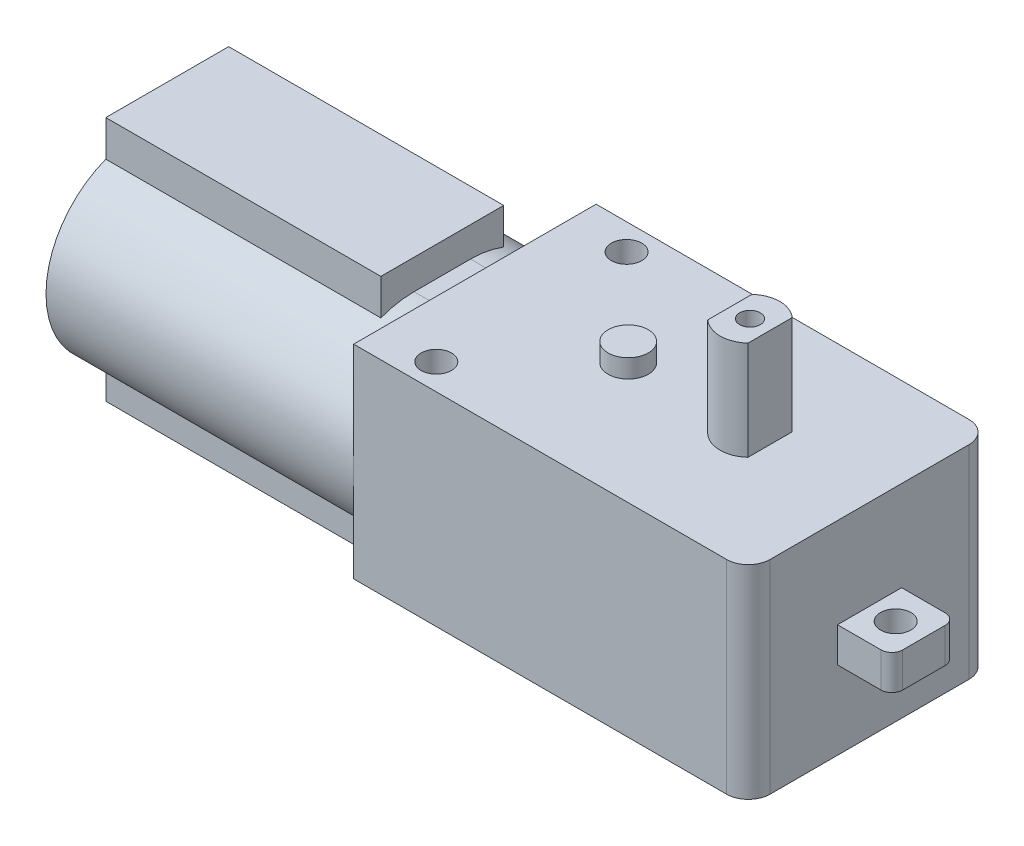
ISO-10303-21;
HEADER;
FILE_DESCRIPTION(('STEP AP214'),'2;1');
FILE_NAME('part.step','',(''),(''),'','','');
FILE_SCHEMA(('AUTOMOTIVE_DESIGN { 1 0 10303 214 1 1 1 1 }'));
ENDSEC;
DATA;
#1=APPLICATION_CONTEXT('core data for automotive mechanical design processes');
#2=APPLICATION_PROTOCOL_DEFINITION('international standard','automotive_design',2000,#1);
#3=PRODUCT_CONTEXT('',#1,'mechanical');
#4=PRODUCT('Part','Part','',(#3));
#5=PRODUCT_RELATED_PRODUCT_CATEGORY('part','',(#4));
#6=PRODUCT_DEFINITION_FORMATION('','',#4);
#7=PRODUCT_DEFINITION_CONTEXT('part definition',#1,'design');
#8=PRODUCT_DEFINITION('design','',#6,#7);
#9=PRODUCT_DEFINITION_SHAPE('','',#8);
#10=(LENGTH_UNIT() NAMED_UNIT(*) SI_UNIT(.MILLI.,.METRE.));
#11=(NAMED_UNIT(*) PLANE_ANGLE_UNIT() SI_UNIT($,.RADIAN.));
#12=(NAMED_UNIT(*) SI_UNIT($,.STERADIAN.) SOLID_ANGLE_UNIT());
#13=UNCERTAINTY_MEASURE_WITH_UNIT(LENGTH_MEASURE(1.E-05),#10,'distance_accuracy_value','');
#14=(GEOMETRIC_REPRESENTATION_CONTEXT(3) GLOBAL_UNCERTAINTY_ASSIGNED_CONTEXT((#13)) GLOBAL_UNIT_ASSIGNED_CONTEXT((#10,
#11,#12)) REPRESENTATION_CONTEXT('',''));
#15=CARTESIAN_POINT('',(0.,0.,0.));
#16=DIRECTION('',(0.,0.,1.));
#17=DIRECTION('',(1.,0.,0.));
#18=AXIS2_PLACEMENT_3D('',#15,#16,#17);
#19=CARTESIAN_POINT('',(-25.3,18.7,-11.15));
#20=DIRECTION('',(1.,0.,0.));
#21=DIRECTION('',(0.,0.,-1.));
#22=AXIS2_PLACEMENT_3D('',#19,#20,#21);
#23=PLANE('',#22);
#24=CARTESIAN_POINT('',(-25.3,8.55,-2.59999999999999));
#25=DIRECTION('',(-1.,0.,0.));
#26=DIRECTION('',(0.,0.,1.));
#27=AXIS2_PLACEMENT_3D('',#24,#25,#26);
#28=CIRCLE('',#27,8.55);
#29=CARTESIAN_POINT('',(-25.3,8.55,-11.15));
#30=VERTEX_POINT('',#29);
#31=CARTESIAN_POINT('',(-25.3,0.,-2.59999999999999));
#32=VERTEX_POINT('',#31);
#33=EDGE_CURVE('E44',#30,#32,#28,.T.);
#34=ORIENTED_EDGE('',*,*,#33,.F.);
#35=DIRECTION('',(0.,-1.,0.));
#36=VECTOR('',#35,1.);
#37=CARTESIAN_POINT('',(-25.3,18.7,-11.15));
#38=LINE('',#37,#36);
#39=CARTESIAN_POINT('',(-25.3,0.,-11.15));
#40=VERTEX_POINT('',#39);
#41=EDGE_CURVE('E448',#30,#40,#38,.T.);
#42=ORIENTED_EDGE('',*,*,#41,.T.);
#43=DIRECTION('',(0.,0.,1.));
#44=VECTOR('',#43,1.);
#45=CARTESIAN_POINT('',(-25.3,0.,-11.15));
#46=LINE('',#45,#44);
#47=EDGE_CURVE('E454',#40,#32,#46,.T.);
#48=ORIENTED_EDGE('',*,*,#47,.T.);
#49=EDGE_LOOP('',(#34,#42,#48));
#50=FACE_BOUND('',#49,.T.);
#51=ADVANCED_FACE('F35',(#50),#23,.F.);
#52=CARTESIAN_POINT('',(-25.3,17.1,-2.59999999999999));
#53=VERTEX_POINT('',#52);
#54=EDGE_CURVE('E300',#53,#30,#28,.T.);
#55=ORIENTED_EDGE('',*,*,#54,.F.);
#56=DIRECTION('',(0.,0.,-1.));
#57=VECTOR('',#56,1.);
#58=CARTESIAN_POINT('',(-25.3,17.1,-2.59999999999999));
#59=LINE('',#58,#57);
#60=CARTESIAN_POINT('',(-25.3,17.1,2.6));
#61=VERTEX_POINT('',#60);
#62=EDGE_CURVE('E297',#61,#53,#59,.T.);
#63=ORIENTED_EDGE('',*,*,#62,.F.);
#64=CARTESIAN_POINT('',(-25.3,8.55,2.6));
#65=DIRECTION('',(-1.,0.,0.));
#66=DIRECTION('',(0.,0.,1.));
#67=AXIS2_PLACEMENT_3D('',#64,#65,#66);
#68=CIRCLE('',#67,8.55);
#69=CARTESIAN_POINT('',(-25.3,8.55,11.15));
#70=VERTEX_POINT('',#69);
#71=EDGE_CURVE('E304',#70,#61,#68,.T.);
#72=ORIENTED_EDGE('',*,*,#71,.F.);
#73=DIRECTION('',(0.,-1.,0.));
#74=VECTOR('',#73,1.);
#75=CARTESIAN_POINT('',(-25.3,18.7,11.15));
#76=LINE('',#75,#74);
#77=CARTESIAN_POINT('',(-25.3,18.7,11.15));
#78=VERTEX_POINT('',#77);
#79=EDGE_CURVE('E460',#78,#70,#76,.T.);
#80=ORIENTED_EDGE('',*,*,#79,.F.);
#81=DIRECTION('',(0.,0.,1.));
#82=VECTOR('',#81,1.);
#83=CARTESIAN_POINT('',(-25.3,18.7,-11.15));
#84=LINE('',#83,#82);
#85=CARTESIAN_POINT('',(-25.3,18.7,-11.15));
#86=VERTEX_POINT('',#85);
#87=EDGE_CURVE('E435',#86,#78,#84,.T.);
#88=ORIENTED_EDGE('',*,*,#87,.F.);
#89=EDGE_CURVE('E476',#86,#30,#38,.T.);
#90=ORIENTED_EDGE('',*,*,#89,.T.);
#91=EDGE_LOOP('',(#55,#63,#72,#80,#88,#90));
#92=FACE_BOUND('',#91,.T.);
#93=ADVANCED_FACE('F533',(#92),#23,.F.);
#94=CARTESIAN_POINT('',(-25.3,0.,2.6));
#95=VERTEX_POINT('',#94);
#96=EDGE_CURVE('E303',#95,#70,#68,.T.);
#97=ORIENTED_EDGE('',*,*,#96,.F.);
#98=CARTESIAN_POINT('',(-25.3,0.,11.15));
#99=VERTEX_POINT('',#98);
#100=EDGE_CURVE('E311',#95,#99,#46,.T.);
#101=ORIENTED_EDGE('',*,*,#100,.T.);
#102=EDGE_CURVE('E463',#70,#99,#76,.T.);
#103=ORIENTED_EDGE('',*,*,#102,.F.);
#104=EDGE_LOOP('',(#97,#101,#103));
#105=FACE_BOUND('',#104,.T.);
#106=ADVANCED_FACE('F523',(#105),#23,.F.);
#107=CARTESIAN_POINT('',(11.,18.7,-9.14999999999999));
#108=DIRECTION('',(-1.,0.,0.));
#109=DIRECTION('',(0.,0.,1.));
#110=AXIS2_PLACEMENT_3D('',#107,#108,#109);
#111=PLANE('',#110);
#112=DIRECTION('',(0.,0.,-1.));
#113=VECTOR('',#112,1.);
#114=CARTESIAN_POINT('',(11.,0.,-9.14999999999999));
#115=LINE('',#114,#113);
#116=CARTESIAN_POINT('',(11.,0.,9.14999999999999));
#117=VERTEX_POINT('',#116);
#118=CARTESIAN_POINT('',(11.,0.,-9.14999999999999));
#119=VERTEX_POINT('',#118);
#120=EDGE_CURVE('E483',#117,#119,#115,.T.);
#121=ORIENTED_EDGE('',*,*,#120,.T.);
#122=DIRECTION('',(0.,-1.,0.));
#123=VECTOR('',#122,1.);
#124=CARTESIAN_POINT('',(11.,18.7,-9.14999999999999));
#125=LINE('',#124,#123);
#126=CARTESIAN_POINT('',(11.,18.7,-9.14999999999999));
#127=VERTEX_POINT('',#126);
#128=EDGE_CURVE('E470',#127,#119,#125,.T.);
#129=ORIENTED_EDGE('',*,*,#128,.F.);
#130=DIRECTION('',(0.,0.,-1.));
#131=VECTOR('',#130,1.);
#132=CARTESIAN_POINT('',(11.,18.7,-9.14999999999999));
#133=LINE('',#132,#131);
#134=CARTESIAN_POINT('',(11.,18.7,9.14999999999999));
#135=VERTEX_POINT('',#134);
#136=EDGE_CURVE('E443',#135,#127,#133,.T.);
#137=ORIENTED_EDGE('',*,*,#136,.F.);
#138=DIRECTION('',(0.,-1.,0.));
#139=VECTOR('',#138,1.);
#140=CARTESIAN_POINT('',(11.,18.7,9.14999999999999));
#141=LINE('',#140,#139);
#142=EDGE_CURVE('E467',#135,#117,#141,.T.);
#143=ORIENTED_EDGE('',*,*,#142,.T.);
#144=EDGE_LOOP('',(#121,#129,#137,#143));
#145=FACE_BOUND('',#144,.T.);
#146=DIRECTION('',(0.,0.,-1.));
#147=VECTOR('',#146,1.);
#148=CARTESIAN_POINT('',(11.,10.4,2.95));
#149=LINE('',#148,#147);
#150=CARTESIAN_POINT('',(11.,10.4,2.95));
#151=VERTEX_POINT('',#150);
#152=CARTESIAN_POINT('',(11.,10.4,-2.95));
#153=VERTEX_POINT('',#152);
#154=EDGE_CURVE('E338',#151,#153,#149,.T.);
#155=ORIENTED_EDGE('',*,*,#154,.T.);
#156=DIRECTION('',(0.,-1.,0.));
#157=VECTOR('',#156,1.);
#158=CARTESIAN_POINT('',(11.,10.4,-2.95));
#159=LINE('',#158,#157);
#160=CARTESIAN_POINT('',(11.,7.2,-2.95));
#161=VERTEX_POINT('',#160);
#162=EDGE_CURVE('E357',#153,#161,#159,.T.);
#163=ORIENTED_EDGE('',*,*,#162,.T.);
#164=DIRECTION('',(0.,0.,-1.));
#165=VECTOR('',#164,1.);
#166=CARTESIAN_POINT('',(11.,7.2,2.95));
#167=LINE('',#166,#165);
#168=CARTESIAN_POINT('',(11.,7.2,2.95));
#169=VERTEX_POINT('',#168);
#170=EDGE_CURVE('E335',#169,#161,#167,.T.);
#171=ORIENTED_EDGE('',*,*,#170,.F.);
#172=DIRECTION('',(0.,-1.,0.));
#173=VECTOR('',#172,1.);
#174=CARTESIAN_POINT('',(11.,10.4,2.95));
#175=LINE('',#174,#173);
#176=EDGE_CURVE('E373',#151,#169,#175,.T.);
#177=ORIENTED_EDGE('',*,*,#176,.F.);
#178=EDGE_LOOP('',(#155,#163,#171,#177));
#179=FACE_BOUND('',#178,.T.);
#180=ADVANCED_FACE('F505',(#145,#179),#111,.F.);
#181=CARTESIAN_POINT('',(9.,18.7,9.15));
#182=DIRECTION('',(0.,1.,0.));
#183=DIRECTION('',(0.,0.,1.));
#184=AXIS2_PLACEMENT_3D('',#181,#182,#183);
#185=PLANE('',#184);
#186=CARTESIAN_POINT('',(-20.1,18.7,8.75));
#187=DIRECTION('',(0.,1.,0.));
#188=DIRECTION('',(0.,0.,1.));
#189=AXIS2_PLACEMENT_3D('',#186,#187,#188);
#190=CIRCLE('',#189,1.4);
#191=CARTESIAN_POINT('',(-20.1,18.7,10.15));
#192=VERTEX_POINT('',#191);
#193=EDGE_CURVE('E424',#192,#192,#190,.T.);
#194=ORIENTED_EDGE('',*,*,#193,.F.);
#195=EDGE_LOOP('',(#194));
#196=FACE_BOUND('',#195,.T.);
#197=ORIENTED_EDGE('',*,*,#87,.T.);
#198=DIRECTION('',(1.,0.,0.));
#199=VECTOR('',#198,1.);
#200=CARTESIAN_POINT('',(-25.3,18.7,11.15));
#201=LINE('',#200,#199);
#202=CARTESIAN_POINT('',(8.99999999999999,18.7,11.15));
#203=VERTEX_POINT('',#202);
#204=EDGE_CURVE('E438',#78,#203,#201,.T.);
#205=ORIENTED_EDGE('',*,*,#204,.T.);
#206=CARTESIAN_POINT('',(9.,18.7,9.15));
#207=DIRECTION('',(0.,1.,0.));
#208=DIRECTION('',(0.,0.,1.));
#209=AXIS2_PLACEMENT_3D('',#206,#207,#208);
#210=CIRCLE('',#209,2.);
#211=EDGE_CURVE('E441',#203,#135,#210,.T.);
#212=ORIENTED_EDGE('',*,*,#211,.T.);
#213=ORIENTED_EDGE('',*,*,#136,.T.);
#214=CARTESIAN_POINT('',(9.,18.7,-9.15));
#215=DIRECTION('',(0.,1.,0.));
#216=DIRECTION('',(0.,0.,-1.));
#217=AXIS2_PLACEMENT_3D('',#214,#215,#216);
#218=CIRCLE('',#217,2.);
#219=CARTESIAN_POINT('',(8.99999999999999,18.7,-11.15));
#220=VERTEX_POINT('',#219);
#221=EDGE_CURVE('E445',#127,#220,#218,.T.);
#222=ORIENTED_EDGE('',*,*,#221,.T.);
#223=DIRECTION('',(-1.,0.,0.));
#224=VECTOR('',#223,1.);
#225=CARTESIAN_POINT('',(-25.3,18.7,-11.15));
#226=LINE('',#225,#224);
#227=EDGE_CURVE('E447',#220,#86,#226,.T.);
#228=ORIENTED_EDGE('',*,*,#227,.T.);
#229=EDGE_LOOP('',(#197,#205,#212,#213,#222,#228));
#230=FACE_BOUND('',#229,.T.);
#231=CARTESIAN_POINT('',(-20.1,18.7,-8.75));
#232=DIRECTION('',(0.,1.,0.));
#233=DIRECTION('',(0.,0.,1.));
#234=AXIS2_PLACEMENT_3D('',#231,#232,#233);
#235=CIRCLE('',#234,1.4);
#236=CARTESIAN_POINT('',(-20.1,18.7,-7.35));
#237=VERTEX_POINT('',#236);
#238=EDGE_CURVE('E430',#237,#237,#235,.T.);
#239=ORIENTED_EDGE('',*,*,#238,.F.);
#240=EDGE_LOOP('',(#239));
#241=FACE_BOUND('',#240,.T.);
#242=DIRECTION('',(0.,0.,1.));
#243=VECTOR('',#242,1.);
#244=CARTESIAN_POINT('',(1.85,18.7,0.));
#245=LINE('',#244,#243);
#246=CARTESIAN_POINT('',(1.85,18.7,-2.03469899493758));
#247=VERTEX_POINT('',#246);
#248=CARTESIAN_POINT('',(1.85,18.7,2.03469899493758));
#249=VERTEX_POINT('',#248);
#250=EDGE_CURVE('E390',#247,#249,#245,.T.);
#251=ORIENTED_EDGE('',*,*,#250,.T.);
#252=CARTESIAN_POINT('',(0.,18.7,0.));
#253=DIRECTION('',(0.,1.,0.));
#254=DIRECTION('',(0.,0.,1.));
#255=AXIS2_PLACEMENT_3D('',#252,#253,#254);
#256=CIRCLE('',#255,2.75);
#257=CARTESIAN_POINT('',(-1.85,18.7,2.03469899493758));
#258=VERTEX_POINT('',#257);
#259=EDGE_CURVE('E397',#258,#249,#256,.T.);
#260=ORIENTED_EDGE('',*,*,#259,.F.);
#261=DIRECTION('',(0.,0.,1.));
#262=VECTOR('',#261,1.);
#263=CARTESIAN_POINT('',(-1.85,18.7,0.));
#264=LINE('',#263,#262);
#265=CARTESIAN_POINT('',(-1.85,18.7,-2.03469899493758));
#266=VERTEX_POINT('',#265);
#267=EDGE_CURVE('E412',#266,#258,#264,.T.);
#268=ORIENTED_EDGE('',*,*,#267,.F.);
#269=EDGE_CURVE('E409',#247,#266,#256,.T.);
#270=ORIENTED_EDGE('',*,*,#269,.F.);
#271=EDGE_LOOP('',(#251,#260,#268,#270));
#272=FACE_BOUND('',#271,.T.);
#273=CARTESIAN_POINT('',(-11.2,18.7,0.));
#274=DIRECTION('',(0.,1.,0.));
#275=DIRECTION('',(0.,0.,1.));
#276=AXIS2_PLACEMENT_3D('',#273,#274,#275);
#277=CIRCLE('',#276,1.85);
#278=CARTESIAN_POINT('',(-11.2,18.7,1.85));
#279=VERTEX_POINT('',#278);
#280=EDGE_CURVE('E376',#279,#279,#277,.T.);
#281=ORIENTED_EDGE('',*,*,#280,.F.);
#282=EDGE_LOOP('',(#281));
#283=FACE_BOUND('',#282,.T.);
#284=ADVANCED_FACE('F514',(#196,#230,#241,#272,#283),#185,.T.);
#285=CARTESIAN_POINT('',(9.,0.,9.15));
#286=DIRECTION('',(0.,1.,0.));
#287=DIRECTION('',(0.,0.,1.));
#288=AXIS2_PLACEMENT_3D('',#285,#286,#287);
#289=PLANE('',#288);
#290=CARTESIAN_POINT('',(-20.1,0.,-8.75));
#291=DIRECTION('',(0.,1.,0.));
#292=DIRECTION('',(0.,0.,1.));
#293=AXIS2_PLACEMENT_3D('',#290,#291,#292);
#294=CIRCLE('',#293,1.4);
#295=CARTESIAN_POINT('',(-20.1,0.,-7.35));
#296=VERTEX_POINT('',#295);
#297=EDGE_CURVE('E427',#296,#296,#294,.T.);
#298=ORIENTED_EDGE('',*,*,#297,.T.);
#299=EDGE_LOOP('',(#298));
#300=FACE_BOUND('',#299,.T.);
#301=DIRECTION('',(1.,0.,0.));
#302=VECTOR('',#301,1.);
#303=CARTESIAN_POINT('',(-53.6,0.,2.6));
#304=LINE('',#303,#302);
#305=CARTESIAN_POINT('',(-28.3,0.,2.6));
#306=VERTEX_POINT('',#305);
#307=EDGE_CURVE('E318',#306,#95,#304,.T.);
#308=ORIENTED_EDGE('',*,*,#307,.F.);
#309=DIRECTION('',(0.,0.,-1.));
#310=VECTOR('',#309,1.);
#311=CARTESIAN_POINT('',(-28.3,0.,9.15000000000001));
#312=LINE('',#311,#310);
#313=CARTESIAN_POINT('',(-28.3,0.,-2.59999999999999));
#314=VERTEX_POINT('',#313);
#315=EDGE_CURVE('E290',#306,#314,#312,.T.);
#316=ORIENTED_EDGE('',*,*,#315,.T.);
#317=DIRECTION('',(1.,0.,0.));
#318=VECTOR('',#317,1.);
#319=CARTESIAN_POINT('',(-53.6,0.,-2.59999999999998));
#320=LINE('',#319,#318);
#321=EDGE_CURVE('E38',#314,#32,#320,.T.);
#322=ORIENTED_EDGE('',*,*,#321,.T.);
#323=ORIENTED_EDGE('',*,*,#47,.F.);
#324=DIRECTION('',(-1.,0.,0.));
#325=VECTOR('',#324,1.);
#326=CARTESIAN_POINT('',(-25.3,0.,-11.15));
#327=LINE('',#326,#325);
#328=CARTESIAN_POINT('',(8.99999999999999,0.,-11.15));
#329=VERTEX_POINT('',#328);
#330=EDGE_CURVE('E439',#329,#40,#327,.T.);
#331=ORIENTED_EDGE('',*,*,#330,.F.);
#332=CARTESIAN_POINT('',(9.,0.,-9.15));
#333=DIRECTION('',(0.,1.,0.));
#334=DIRECTION('',(0.,0.,-1.));
#335=AXIS2_PLACEMENT_3D('',#332,#333,#334);
#336=CIRCLE('',#335,2.);
#337=EDGE_CURVE('E481',#119,#329,#336,.T.);
#338=ORIENTED_EDGE('',*,*,#337,.F.);
#339=ORIENTED_EDGE('',*,*,#120,.F.);
#340=CARTESIAN_POINT('',(9.,0.,9.15));
#341=DIRECTION('',(0.,1.,0.));
#342=DIRECTION('',(0.,0.,1.));
#343=AXIS2_PLACEMENT_3D('',#340,#341,#342);
#344=CIRCLE('',#343,2.);
#345=CARTESIAN_POINT('',(8.99999999999999,0.,11.15));
#346=VERTEX_POINT('',#345);
#347=EDGE_CURVE('E484',#346,#117,#344,.T.);
#348=ORIENTED_EDGE('',*,*,#347,.F.);
#349=DIRECTION('',(1.,0.,0.));
#350=VECTOR('',#349,1.);
#351=CARTESIAN_POINT('',(-25.3,0.,11.15));
#352=LINE('',#351,#350);
#353=EDGE_CURVE('E451',#99,#346,#352,.T.);
#354=ORIENTED_EDGE('',*,*,#353,.F.);
#355=ORIENTED_EDGE('',*,*,#100,.F.);
#356=EDGE_LOOP('',(#308,#316,#322,#323,#331,#338,#339,#348,#354,#355));
#357=FACE_BOUND('',#356,.T.);
#358=CARTESIAN_POINT('',(-20.1,0.,8.75));
#359=DIRECTION('',(0.,1.,0.));
#360=DIRECTION('',(0.,0.,1.));
#361=AXIS2_PLACEMENT_3D('',#358,#359,#360);
#362=CIRCLE('',#361,1.4);
#363=CARTESIAN_POINT('',(-20.1,0.,10.15));
#364=VERTEX_POINT('',#363);
#365=EDGE_CURVE('E423',#364,#364,#362,.T.);
#366=ORIENTED_EDGE('',*,*,#365,.T.);
#367=EDGE_LOOP('',(#366));
#368=FACE_BOUND('',#367,.T.);
#369=ADVANCED_FACE('F499',(#300,#357,#368),#289,.F.);
#370=CARTESIAN_POINT('',(-25.3,18.7,11.15));
#371=DIRECTION('',(0.,0.,-1.));
#372=DIRECTION('',(-1.,0.,0.));
#373=AXIS2_PLACEMENT_3D('',#370,#371,#372);
#374=PLANE('',#373);
#375=ORIENTED_EDGE('',*,*,#353,.T.);
#376=DIRECTION('',(0.,-1.,0.));
#377=VECTOR('',#376,1.);
#378=CARTESIAN_POINT('',(8.99999999999999,18.7,11.15));
#379=LINE('',#378,#377);
#380=EDGE_CURVE('E464',#203,#346,#379,.T.);
#381=ORIENTED_EDGE('',*,*,#380,.F.);
#382=ORIENTED_EDGE('',*,*,#204,.F.);
#383=ORIENTED_EDGE('',*,*,#79,.T.);
#384=ORIENTED_EDGE('',*,*,#102,.T.);
#385=EDGE_LOOP('',(#375,#381,#382,#383,#384));
#386=FACE_BOUND('',#385,.T.);
#387=ADVANCED_FACE('F491',(#386),#374,.F.);
#388=CARTESIAN_POINT('',(9.,18.7,9.15));
#389=DIRECTION('',(0.,-1.,0.));
#390=DIRECTION('',(0.,0.,-1.));
#391=AXIS2_PLACEMENT_3D('',#388,#389,#390);
#392=CYLINDRICAL_SURFACE('',#391,2.);
#393=ORIENTED_EDGE('',*,*,#347,.T.);
#394=ORIENTED_EDGE('',*,*,#142,.F.);
#395=ORIENTED_EDGE('',*,*,#211,.F.);
#396=ORIENTED_EDGE('',*,*,#380,.T.);
#397=EDGE_LOOP('',(#393,#394,#395,#396));
#398=FACE_BOUND('',#397,.T.);
#399=ADVANCED_FACE('F497',(#398),#392,.T.);
#400=CARTESIAN_POINT('',(9.,18.7,-9.15));
#401=DIRECTION('',(0.,-1.,0.));
#402=DIRECTION('',(0.,0.,-1.));
#403=AXIS2_PLACEMENT_3D('',#400,#401,#402);
#404=CYLINDRICAL_SURFACE('',#403,2.);
#405=ORIENTED_EDGE('',*,*,#337,.T.);
#406=DIRECTION('',(0.,-1.,0.));
#407=VECTOR('',#406,1.);
#408=CARTESIAN_POINT('',(8.99999999999999,18.7,-11.15));
#409=LINE('',#408,#407);
#410=EDGE_CURVE('E473',#220,#329,#409,.T.);
#411=ORIENTED_EDGE('',*,*,#410,.F.);
#412=ORIENTED_EDGE('',*,*,#221,.F.);
#413=ORIENTED_EDGE('',*,*,#128,.T.);
#414=EDGE_LOOP('',(#405,#411,#412,#413));
#415=FACE_BOUND('',#414,.T.);
#416=ADVANCED_FACE('F510',(#415),#404,.T.);
#417=CARTESIAN_POINT('',(-25.3,18.7,-11.15));
#418=DIRECTION('',(0.,0.,1.));
#419=DIRECTION('',(1.,0.,0.));
#420=AXIS2_PLACEMENT_3D('',#417,#418,#419);
#421=PLANE('',#420);
#422=ORIENTED_EDGE('',*,*,#330,.T.);
#423=ORIENTED_EDGE('',*,*,#41,.F.);
#424=ORIENTED_EDGE('',*,*,#89,.F.);
#425=ORIENTED_EDGE('',*,*,#227,.F.);
#426=ORIENTED_EDGE('',*,*,#410,.T.);
#427=EDGE_LOOP('',(#422,#423,#424,#425,#426));
#428=FACE_BOUND('',#427,.T.);
#429=ADVANCED_FACE('F532',(#428),#421,.F.);
#430=CARTESIAN_POINT('',(-20.1,18.7,-8.75));
#431=DIRECTION('',(0.,-1.,0.));
#432=DIRECTION('',(0.,0.,-1.));
#433=AXIS2_PLACEMENT_3D('',#430,#431,#432);
#434=CYLINDRICAL_SURFACE('',#433,1.4);
#435=ORIENTED_EDGE('',*,*,#238,.T.);
#436=EDGE_LOOP('',(#435));
#437=FACE_BOUND('',#436,.T.);
#438=ORIENTED_EDGE('',*,*,#297,.F.);
#439=EDGE_LOOP('',(#438));
#440=FACE_BOUND('',#439,.T.);
#441=ADVANCED_FACE('F595',(#437,#440),#434,.F.);
#442=CARTESIAN_POINT('',(-20.1,18.7,8.75));
#443=DIRECTION('',(0.,-1.,0.));
#444=DIRECTION('',(0.,0.,-1.));
#445=AXIS2_PLACEMENT_3D('',#442,#443,#444);
#446=CYLINDRICAL_SURFACE('',#445,1.4);
#447=ORIENTED_EDGE('',*,*,#193,.T.);
#448=EDGE_LOOP('',(#447));
#449=FACE_BOUND('',#448,.T.);
#450=ORIENTED_EDGE('',*,*,#365,.F.);
#451=EDGE_LOOP('',(#450));
#452=FACE_BOUND('',#451,.T.);
#453=ADVANCED_FACE('F600',(#449,#452),#446,.F.);
#454=CARTESIAN_POINT('',(1.85,27.8,0.));
#455=DIRECTION('',(1.,0.,0.));
#456=DIRECTION('',(0.,0.,-1.));
#457=AXIS2_PLACEMENT_3D('',#454,#455,#456);
#458=PLANE('',#457);
#459=ORIENTED_EDGE('',*,*,#250,.F.);
#460=DIRECTION('',(0.,-1.,0.));
#461=VECTOR('',#460,1.);
#462=CARTESIAN_POINT('',(1.85,27.8,-2.03469899493758));
#463=LINE('',#462,#461);
#464=CARTESIAN_POINT('',(1.85,27.8,-2.03469899493758));
#465=VERTEX_POINT('',#464);
#466=EDGE_CURVE('E421',#465,#247,#463,.T.);
#467=ORIENTED_EDGE('',*,*,#466,.F.);
#468=DIRECTION('',(0.,0.,1.));
#469=VECTOR('',#468,1.);
#470=CARTESIAN_POINT('',(1.85,27.8,0.));
#471=LINE('',#470,#469);
#472=CARTESIAN_POINT('',(1.85,27.8,2.03469899493758));
#473=VERTEX_POINT('',#472);
#474=EDGE_CURVE('E396',#465,#473,#471,.T.);
#475=ORIENTED_EDGE('',*,*,#474,.T.);
#476=DIRECTION('',(0.,-1.,0.));
#477=VECTOR('',#476,1.);
#478=CARTESIAN_POINT('',(1.85,27.8,2.03469899493758));
#479=LINE('',#478,#477);
#480=EDGE_CURVE('E414',#473,#249,#479,.T.);
#481=ORIENTED_EDGE('',*,*,#480,.T.);
#482=EDGE_LOOP('',(#459,#467,#475,#481));
#483=FACE_BOUND('',#482,.T.);
#484=ADVANCED_FACE('F633',(#483),#458,.T.);
#485=CARTESIAN_POINT('',(0.,27.8,0.));
#486=DIRECTION('',(0.,-1.,0.));
#487=DIRECTION('',(0.,0.,-1.));
#488=AXIS2_PLACEMENT_3D('',#485,#486,#487);
#489=CYLINDRICAL_SURFACE('',#488,2.75);
#490=ORIENTED_EDGE('',*,*,#269,.T.);
#491=DIRECTION('',(0.,-1.,0.));
#492=VECTOR('',#491,1.);
#493=CARTESIAN_POINT('',(-1.85,27.8,-2.03469899493758));
#494=LINE('',#493,#492);
#495=CARTESIAN_POINT('',(-1.85,27.8,-2.03469899493758));
#496=VERTEX_POINT('',#495);
#497=EDGE_CURVE('E419',#496,#266,#494,.T.);
#498=ORIENTED_EDGE('',*,*,#497,.F.);
#499=CARTESIAN_POINT('',(0.,27.8,0.));
#500=DIRECTION('',(0.,1.,0.));
#501=DIRECTION('',(0.,0.,1.));
#502=AXIS2_PLACEMENT_3D('',#499,#500,#501);
#503=CIRCLE('',#502,2.75);
#504=EDGE_CURVE('E400',#465,#496,#503,.T.);
#505=ORIENTED_EDGE('',*,*,#504,.F.);
#506=ORIENTED_EDGE('',*,*,#466,.T.);
#507=EDGE_LOOP('',(#490,#498,#505,#506));
#508=FACE_BOUND('',#507,.T.);
#509=ADVANCED_FACE('F653',(#508),#489,.T.);
#510=CARTESIAN_POINT('',(-1.85,27.8,0.));
#511=DIRECTION('',(1.,0.,0.));
#512=DIRECTION('',(0.,0.,-1.));
#513=AXIS2_PLACEMENT_3D('',#510,#511,#512);
#514=PLANE('',#513);
#515=ORIENTED_EDGE('',*,*,#267,.T.);
#516=DIRECTION('',(0.,-1.,0.));
#517=VECTOR('',#516,1.);
#518=CARTESIAN_POINT('',(-1.85,27.8,2.03469899493758));
#519=LINE('',#518,#517);
#520=CARTESIAN_POINT('',(-1.85,27.8,2.03469899493758));
#521=VERTEX_POINT('',#520);
#522=EDGE_CURVE('E416',#521,#258,#519,.T.);
#523=ORIENTED_EDGE('',*,*,#522,.F.);
#524=DIRECTION('',(0.,0.,1.));
#525=VECTOR('',#524,1.);
#526=CARTESIAN_POINT('',(-1.85,27.8,0.));
#527=LINE('',#526,#525);
#528=EDGE_CURVE('E403',#496,#521,#527,.T.);
#529=ORIENTED_EDGE('',*,*,#528,.F.);
#530=ORIENTED_EDGE('',*,*,#497,.T.);
#531=EDGE_LOOP('',(#515,#523,#529,#530));
#532=FACE_BOUND('',#531,.T.);
#533=ADVANCED_FACE('F662',(#532),#514,.F.);
#534=CARTESIAN_POINT('',(0.,27.8,0.));
#535=DIRECTION('',(0.,-1.,0.));
#536=DIRECTION('',(0.,0.,-1.));
#537=AXIS2_PLACEMENT_3D('',#534,#535,#536);
#538=CYLINDRICAL_SURFACE('',#537,0.95);
#539=CARTESIAN_POINT('',(0.,27.8,0.));
#540=DIRECTION('',(0.,1.,0.));
#541=DIRECTION('',(0.,0.,1.));
#542=AXIS2_PLACEMENT_3D('',#539,#540,#541);
#543=CIRCLE('',#542,0.95);
#544=CARTESIAN_POINT('',(0.,27.8,0.95));
#545=VERTEX_POINT('',#544);
#546=EDGE_CURVE('E393',#545,#545,#543,.T.);
#547=ORIENTED_EDGE('',*,*,#546,.T.);
#548=EDGE_LOOP('',(#547));
#549=FACE_BOUND('',#548,.T.);
#550=CARTESIAN_POINT('',(0.,18.7,0.));
#551=DIRECTION('',(0.,1.,0.));
#552=DIRECTION('',(0.,0.,1.));
#553=AXIS2_PLACEMENT_3D('',#550,#551,#552);
#554=CIRCLE('',#553,0.95);
#555=CARTESIAN_POINT('',(0.,18.7,0.95));
#556=VERTEX_POINT('',#555);
#557=EDGE_CURVE('E457',#556,#556,#554,.F.);
#558=ORIENTED_EDGE('',*,*,#557,.T.);
#559=EDGE_LOOP('',(#558));
#560=FACE_BOUND('',#559,.T.);
#561=ADVANCED_FACE('F672',(#549,#560),#538,.F.);
#562=ORIENTED_EDGE('',*,*,#259,.T.);
#563=ORIENTED_EDGE('',*,*,#480,.F.);
#564=EDGE_CURVE('E404',#521,#473,#503,.T.);
#565=ORIENTED_EDGE('',*,*,#564,.F.);
#566=ORIENTED_EDGE('',*,*,#522,.T.);
#567=EDGE_LOOP('',(#562,#563,#565,#566));
#568=FACE_BOUND('',#567,.T.);
#569=ADVANCED_FACE('F665',(#568),#489,.T.);
#570=CARTESIAN_POINT('',(0.,27.8,0.));
#571=DIRECTION('',(0.,1.,0.));
#572=DIRECTION('',(0.,0.,1.));
#573=AXIS2_PLACEMENT_3D('',#570,#571,#572);
#574=PLANE('',#573);
#575=ORIENTED_EDGE('',*,*,#546,.F.);
#576=EDGE_LOOP('',(#575));
#577=FACE_BOUND('',#576,.T.);
#578=ORIENTED_EDGE('',*,*,#474,.F.);
#579=ORIENTED_EDGE('',*,*,#504,.T.);
#580=ORIENTED_EDGE('',*,*,#528,.T.);
#581=ORIENTED_EDGE('',*,*,#564,.T.);
#582=EDGE_LOOP('',(#578,#579,#580,#581));
#583=FACE_BOUND('',#582,.T.);
#584=ADVANCED_FACE('F644',(#577,#583),#574,.T.);
#585=ORIENTED_EDGE('',*,*,#557,.F.);
#586=EDGE_LOOP('',(#585));
#587=FACE_BOUND('',#586,.T.);
#588=ADVANCED_FACE('F580',(#587),#185,.T.);
#589=CARTESIAN_POINT('',(-11.2,20.4,0.));
#590=DIRECTION('',(0.,-1.,0.));
#591=DIRECTION('',(0.,0.,-1.));
#592=AXIS2_PLACEMENT_3D('',#589,#590,#591);
#593=CYLINDRICAL_SURFACE('',#592,1.85);
#594=CARTESIAN_POINT('',(-11.2,20.4,0.));
#595=DIRECTION('',(0.,1.,0.));
#596=DIRECTION('',(0.,0.,1.));
#597=AXIS2_PLACEMENT_3D('',#594,#595,#596);
#598=CIRCLE('',#597,1.85);
#599=CARTESIAN_POINT('',(-11.2,20.4,1.85));
#600=VERTEX_POINT('',#599);
#601=EDGE_CURVE('E387',#600,#600,#598,.T.);
#602=ORIENTED_EDGE('',*,*,#601,.F.);
#603=EDGE_LOOP('',(#602));
#604=FACE_BOUND('',#603,.T.);
#605=ORIENTED_EDGE('',*,*,#280,.T.);
#606=EDGE_LOOP('',(#605));
#607=FACE_BOUND('',#606,.T.);
#608=ADVANCED_FACE('F643',(#604,#607),#593,.T.);
#609=CARTESIAN_POINT('',(-11.2,20.4,0.));
#610=DIRECTION('',(0.,1.,0.));
#611=DIRECTION('',(0.,0.,1.));
#612=AXIS2_PLACEMENT_3D('',#609,#610,#611);
#613=PLANE('',#612);
#614=ORIENTED_EDGE('',*,*,#601,.T.);
#615=EDGE_LOOP('',(#614));
#616=FACE_BOUND('',#615,.T.);
#617=ADVANCED_FACE('F707',(#616),#613,.T.);
#618=CARTESIAN_POINT('',(11.,10.4,2.95));
#619=DIRECTION('',(0.,0.,1.));
#620=DIRECTION('',(1.,0.,0.));
#621=AXIS2_PLACEMENT_3D('',#618,#619,#620);
#622=PLANE('',#621);
#623=DIRECTION('',(-1.,0.,0.));
#624=VECTOR('',#623,1.);
#625=CARTESIAN_POINT('',(11.,7.2,2.95));
#626=LINE('',#625,#624);
#627=CARTESIAN_POINT('',(15.,7.2,2.95));
#628=VERTEX_POINT('',#627);
#629=EDGE_CURVE('E342',#628,#169,#626,.T.);
#630=ORIENTED_EDGE('',*,*,#629,.F.);
#631=DIRECTION('',(0.,-1.,0.));
#632=VECTOR('',#631,1.);
#633=CARTESIAN_POINT('',(15.,10.4,2.95));
#634=LINE('',#633,#632);
#635=CARTESIAN_POINT('',(15.,10.4,2.95));
#636=VERTEX_POINT('',#635);
#637=EDGE_CURVE('E377',#636,#628,#634,.T.);
#638=ORIENTED_EDGE('',*,*,#637,.F.);
#639=DIRECTION('',(-1.,0.,0.));
#640=VECTOR('',#639,1.);
#641=CARTESIAN_POINT('',(11.,10.4,2.95));
#642=LINE('',#641,#640);
#643=EDGE_CURVE('E354',#636,#151,#642,.T.);
#644=ORIENTED_EDGE('',*,*,#643,.T.);
#645=ORIENTED_EDGE('',*,*,#176,.T.);
#646=EDGE_LOOP('',(#630,#638,#644,#645));
#647=FACE_BOUND('',#646,.T.);
#648=ADVANCED_FACE('F716',(#647),#622,.T.);
#649=CARTESIAN_POINT('',(15.,10.4,1.95));
#650=DIRECTION('',(0.,-1.,0.));
#651=DIRECTION('',(0.,0.,-1.));
#652=AXIS2_PLACEMENT_3D('',#649,#650,#651);
#653=CYLINDRICAL_SURFACE('',#652,1.);
#654=CARTESIAN_POINT('',(15.,7.2,1.95));
#655=DIRECTION('',(0.,-1.,0.));
#656=DIRECTION('',(0.,0.,1.));
#657=AXIS2_PLACEMENT_3D('',#654,#655,#656);
#658=CIRCLE('',#657,1.);
#659=CARTESIAN_POINT('',(16.,7.2,1.94999999999999));
#660=VERTEX_POINT('',#659);
#661=EDGE_CURVE('E369',#660,#628,#658,.T.);
#662=ORIENTED_EDGE('',*,*,#661,.F.);
#663=DIRECTION('',(0.,-1.,0.));
#664=VECTOR('',#663,1.);
#665=CARTESIAN_POINT('',(16.,10.4,1.94999999999999));
#666=LINE('',#665,#664);
#667=CARTESIAN_POINT('',(16.,10.4,1.94999999999999));
#668=VERTEX_POINT('',#667);
#669=EDGE_CURVE('E379',#668,#660,#666,.T.);
#670=ORIENTED_EDGE('',*,*,#669,.F.);
#671=CARTESIAN_POINT('',(15.,10.4,1.95));
#672=DIRECTION('',(0.,-1.,0.));
#673=DIRECTION('',(0.,0.,1.));
#674=AXIS2_PLACEMENT_3D('',#671,#672,#673);
#675=CIRCLE('',#674,1.);
#676=EDGE_CURVE('E351',#668,#636,#675,.T.);
#677=ORIENTED_EDGE('',*,*,#676,.T.);
#678=ORIENTED_EDGE('',*,*,#637,.T.);
#679=EDGE_LOOP('',(#662,#670,#677,#678));
#680=FACE_BOUND('',#679,.T.);
#681=ADVANCED_FACE('F729',(#680),#653,.T.);
#682=CARTESIAN_POINT('',(16.,10.4,1.94999999999999));
#683=DIRECTION('',(1.,0.,0.));
#684=DIRECTION('',(0.,0.,-1.));
#685=AXIS2_PLACEMENT_3D('',#682,#683,#684);
#686=PLANE('',#685);
#687=DIRECTION('',(0.,0.,1.));
#688=VECTOR('',#687,1.);
#689=CARTESIAN_POINT('',(16.,7.2,1.94999999999999));
#690=LINE('',#689,#688);
#691=CARTESIAN_POINT('',(16.,7.2,-1.94999999999999));
#692=VERTEX_POINT('',#691);
#693=EDGE_CURVE('E366',#692,#660,#690,.T.);
#694=ORIENTED_EDGE('',*,*,#693,.F.);
#695=DIRECTION('',(0.,-1.,0.));
#696=VECTOR('',#695,1.);
#697=CARTESIAN_POINT('',(16.,10.4,-1.94999999999999));
#698=LINE('',#697,#696);
#699=CARTESIAN_POINT('',(16.,10.4,-1.94999999999999));
#700=VERTEX_POINT('',#699);
#701=EDGE_CURVE('E381',#700,#692,#698,.T.);
#702=ORIENTED_EDGE('',*,*,#701,.F.);
#703=DIRECTION('',(0.,0.,1.));
#704=VECTOR('',#703,1.);
#705=CARTESIAN_POINT('',(16.,10.4,1.94999999999999));
#706=LINE('',#705,#704);
#707=EDGE_CURVE('E348',#700,#668,#706,.T.);
#708=ORIENTED_EDGE('',*,*,#707,.T.);
#709=ORIENTED_EDGE('',*,*,#669,.T.);
#710=EDGE_LOOP('',(#694,#702,#708,#709));
#711=FACE_BOUND('',#710,.T.);
#712=ADVANCED_FACE('F738',(#711),#686,.T.);
#713=CARTESIAN_POINT('',(15.,10.4,-1.95));
#714=DIRECTION('',(0.,-1.,0.));
#715=DIRECTION('',(0.,0.,-1.));
#716=AXIS2_PLACEMENT_3D('',#713,#714,#715);
#717=CYLINDRICAL_SURFACE('',#716,1.);
#718=CARTESIAN_POINT('',(15.,7.2,-1.95));
#719=DIRECTION('',(0.,-1.,0.));
#720=DIRECTION('',(0.,0.,-1.));
#721=AXIS2_PLACEMENT_3D('',#718,#719,#720);
#722=CIRCLE('',#721,1.);
#723=CARTESIAN_POINT('',(15.,7.2,-2.95));
#724=VERTEX_POINT('',#723);
#725=EDGE_CURVE('E363',#724,#692,#722,.T.);
#726=ORIENTED_EDGE('',*,*,#725,.F.);
#727=DIRECTION('',(0.,-1.,0.));
#728=VECTOR('',#727,1.);
#729=CARTESIAN_POINT('',(15.,10.4,-2.95));
#730=LINE('',#729,#728);
#731=CARTESIAN_POINT('',(15.,10.4,-2.95));
#732=VERTEX_POINT('',#731);
#733=EDGE_CURVE('E383',#732,#724,#730,.T.);
#734=ORIENTED_EDGE('',*,*,#733,.F.);
#735=CARTESIAN_POINT('',(15.,10.4,-1.95));
#736=DIRECTION('',(0.,-1.,0.));
#737=DIRECTION('',(0.,0.,-1.));
#738=AXIS2_PLACEMENT_3D('',#735,#736,#737);
#739=CIRCLE('',#738,1.);
#740=EDGE_CURVE('E345',#732,#700,#739,.T.);
#741=ORIENTED_EDGE('',*,*,#740,.T.);
#742=ORIENTED_EDGE('',*,*,#701,.T.);
#743=EDGE_LOOP('',(#726,#734,#741,#742));
#744=FACE_BOUND('',#743,.T.);
#745=ADVANCED_FACE('F747',(#744),#717,.T.);
#746=CARTESIAN_POINT('',(11.,10.4,-2.95));
#747=DIRECTION('',(0.,0.,-1.));
#748=DIRECTION('',(-1.,0.,0.));
#749=AXIS2_PLACEMENT_3D('',#746,#747,#748);
#750=PLANE('',#749);
#751=DIRECTION('',(1.,0.,0.));
#752=VECTOR('',#751,1.);
#753=CARTESIAN_POINT('',(11.,7.2,-2.95));
#754=LINE('',#753,#752);
#755=EDGE_CURVE('E360',#161,#724,#754,.T.);
#756=ORIENTED_EDGE('',*,*,#755,.F.);
#757=ORIENTED_EDGE('',*,*,#162,.F.);
#758=DIRECTION('',(1.,0.,0.));
#759=VECTOR('',#758,1.);
#760=CARTESIAN_POINT('',(11.,10.4,-2.95));
#761=LINE('',#760,#759);
#762=EDGE_CURVE('E341',#153,#732,#761,.T.);
#763=ORIENTED_EDGE('',*,*,#762,.T.);
#764=ORIENTED_EDGE('',*,*,#733,.T.);
#765=EDGE_LOOP('',(#756,#757,#763,#764));
#766=FACE_BOUND('',#765,.T.);
#767=ADVANCED_FACE('F756',(#766),#750,.T.);
#768=CARTESIAN_POINT('',(15.,10.4,-1.95));
#769=DIRECTION('',(0.,-1.,0.));
#770=DIRECTION('',(0.,0.,-1.));
#771=AXIS2_PLACEMENT_3D('',#768,#769,#770);
#772=PLANE('',#771);
#773=CARTESIAN_POINT('',(13.4,10.4,0.));
#774=DIRECTION('',(0.,-1.,0.));
#775=DIRECTION('',(0.,0.,-1.));
#776=AXIS2_PLACEMENT_3D('',#773,#774,#775);
#777=CIRCLE('',#776,1.4);
#778=CARTESIAN_POINT('',(13.4,10.4,-1.4));
#779=VERTEX_POINT('',#778);
#780=EDGE_CURVE('E332',#779,#779,#777,.T.);
#781=ORIENTED_EDGE('',*,*,#780,.T.);
#782=EDGE_LOOP('',(#781));
#783=FACE_BOUND('',#782,.T.);
#784=ORIENTED_EDGE('',*,*,#154,.F.);
#785=ORIENTED_EDGE('',*,*,#643,.F.);
#786=ORIENTED_EDGE('',*,*,#676,.F.);
#787=ORIENTED_EDGE('',*,*,#707,.F.);
#788=ORIENTED_EDGE('',*,*,#740,.F.);
#789=ORIENTED_EDGE('',*,*,#762,.F.);
#790=EDGE_LOOP('',(#784,#785,#786,#787,#788,#789));
#791=FACE_BOUND('',#790,.T.);
#792=ADVANCED_FACE('F765',(#783,#791),#772,.F.);
#793=CARTESIAN_POINT('',(15.,7.2,-1.95));
#794=DIRECTION('',(0.,-1.,0.));
#795=DIRECTION('',(0.,0.,-1.));
#796=AXIS2_PLACEMENT_3D('',#793,#794,#795);
#797=PLANE('',#796);
#798=CARTESIAN_POINT('',(13.4,7.2,0.));
#799=DIRECTION('',(0.,-1.,0.));
#800=DIRECTION('',(0.,0.,-1.));
#801=AXIS2_PLACEMENT_3D('',#798,#799,#800);
#802=CIRCLE('',#801,1.4);
#803=CARTESIAN_POINT('',(13.4,7.2,-1.4));
#804=VERTEX_POINT('',#803);
#805=EDGE_CURVE('E324',#804,#804,#802,.T.);
#806=ORIENTED_EDGE('',*,*,#805,.F.);
#807=EDGE_LOOP('',(#806));
#808=FACE_BOUND('',#807,.T.);
#809=ORIENTED_EDGE('',*,*,#170,.T.);
#810=ORIENTED_EDGE('',*,*,#755,.T.);
#811=ORIENTED_EDGE('',*,*,#725,.T.);
#812=ORIENTED_EDGE('',*,*,#693,.T.);
#813=ORIENTED_EDGE('',*,*,#661,.T.);
#814=ORIENTED_EDGE('',*,*,#629,.T.);
#815=EDGE_LOOP('',(#809,#810,#811,#812,#813,#814));
#816=FACE_BOUND('',#815,.T.);
#817=ADVANCED_FACE('F774',(#808,#816),#797,.T.);
#818=CARTESIAN_POINT('',(13.4,10.4,0.));
#819=DIRECTION('',(0.,-1.,0.));
#820=DIRECTION('',(0.,0.,-1.));
#821=AXIS2_PLACEMENT_3D('',#818,#819,#820);
#822=CYLINDRICAL_SURFACE('',#821,1.4);
#823=ORIENTED_EDGE('',*,*,#780,.F.);
#824=EDGE_LOOP('',(#823));
#825=FACE_BOUND('',#824,.T.);
#826=ORIENTED_EDGE('',*,*,#805,.T.);
#827=EDGE_LOOP('',(#826));
#828=FACE_BOUND('',#827,.T.);
#829=ADVANCED_FACE('F783',(#825,#828),#822,.F.);
#830=CARTESIAN_POINT('',(-53.6,8.55,-2.59999999999998));
#831=DIRECTION('',(1.,0.,0.));
#832=DIRECTION('',(0.,0.,-1.));
#833=AXIS2_PLACEMENT_3D('',#830,#831,#832);
#834=CYLINDRICAL_SURFACE('',#833,8.55);
#835=DIRECTION('',(1.,0.,0.));
#836=VECTOR('',#835,1.);
#837=CARTESIAN_POINT('',(-53.6,16.5374902190863,-5.64999999999999));
#838=LINE('',#837,#836);
#839=CARTESIAN_POINT('',(-53.6,16.5374902190863,-5.64999999999999));
#840=VERTEX_POINT('',#839);
#841=CARTESIAN_POINT('',(-28.3,16.5374902190863,-5.65));
#842=VERTEX_POINT('',#841);
#843=EDGE_CURVE('E282',#840,#842,#838,.T.);
#844=ORIENTED_EDGE('',*,*,#843,.T.);
#845=CARTESIAN_POINT('',(-28.3,8.55,-2.59999999999999));
#846=DIRECTION('',(1.,0.,0.));
#847=DIRECTION('',(0.,0.,-1.));
#848=AXIS2_PLACEMENT_3D('',#845,#846,#847);
#849=CIRCLE('',#848,8.55);
#850=CARTESIAN_POINT('',(-28.3,17.1,-2.59999999999999));
#851=VERTEX_POINT('',#850);
#852=EDGE_CURVE('E237',#842,#851,#849,.T.);
#853=ORIENTED_EDGE('',*,*,#852,.T.);
#854=DIRECTION('',(1.,0.,0.));
#855=VECTOR('',#854,1.);
#856=CARTESIAN_POINT('',(-53.6,17.1,-2.59999999999998));
#857=LINE('',#856,#855);
#858=EDGE_CURVE('E60',#851,#53,#857,.T.);
#859=ORIENTED_EDGE('',*,*,#858,.T.);
#860=ORIENTED_EDGE('',*,*,#54,.T.);
#861=ORIENTED_EDGE('',*,*,#33,.T.);
#862=ORIENTED_EDGE('',*,*,#321,.F.);
#863=CARTESIAN_POINT('',(-28.3,0.562509780913656,-5.64999999999999));
#864=VERTEX_POINT('',#863);
#865=EDGE_CURVE('E289',#314,#864,#849,.T.);
#866=ORIENTED_EDGE('',*,*,#865,.T.);
#867=DIRECTION('',(1.,0.,0.));
#868=VECTOR('',#867,1.);
#869=CARTESIAN_POINT('',(-53.6,0.562509780913656,-5.64999999999999));
#870=LINE('',#869,#868);
#871=CARTESIAN_POINT('',(-53.6,0.562509780913656,-5.64999999999999));
#872=VERTEX_POINT('',#871);
#873=EDGE_CURVE('E279',#864,#872,#870,.F.);
#874=ORIENTED_EDGE('',*,*,#873,.T.);
#875=CARTESIAN_POINT('',(-53.6,8.55,-2.59999999999998));
#876=DIRECTION('',(-1.,0.,0.));
#877=DIRECTION('',(0.,0.,1.));
#878=AXIS2_PLACEMENT_3D('',#875,#876,#877);
#879=CIRCLE('',#878,8.55);
#880=EDGE_CURVE('E293',#840,#872,#879,.T.);
#881=ORIENTED_EDGE('',*,*,#880,.F.);
#882=EDGE_LOOP('',(#844,#853,#859,#860,#861,#862,#866,#874,#881));
#883=FACE_BOUND('',#882,.T.);
#884=ADVANCED_FACE('F528',(#883),#834,.T.);
#885=CARTESIAN_POINT('',(-53.6,8.55,2.6));
#886=DIRECTION('',(1.,0.,0.));
#887=DIRECTION('',(0.,0.,-1.));
#888=AXIS2_PLACEMENT_3D('',#885,#886,#887);
#889=CYLINDRICAL_SURFACE('',#888,8.55);
#890=DIRECTION('',(1.,0.,0.));
#891=VECTOR('',#890,1.);
#892=CARTESIAN_POINT('',(-53.6,0.562509780913656,5.65000000000001));
#893=LINE('',#892,#891);
#894=CARTESIAN_POINT('',(-53.6,0.562509780913656,5.65000000000001));
#895=VERTEX_POINT('',#894);
#896=CARTESIAN_POINT('',(-28.3,0.562509780913656,5.65000000000001));
#897=VERTEX_POINT('',#896);
#898=EDGE_CURVE('E276',#895,#897,#893,.T.);
#899=ORIENTED_EDGE('',*,*,#898,.T.);
#900=CARTESIAN_POINT('',(-28.3,8.55,2.6));
#901=DIRECTION('',(1.,0.,0.));
#902=DIRECTION('',(0.,0.,-1.));
#903=AXIS2_PLACEMENT_3D('',#900,#901,#902);
#904=CIRCLE('',#903,8.55);
#905=EDGE_CURVE('E287',#897,#306,#904,.T.);
#906=ORIENTED_EDGE('',*,*,#905,.T.);
#907=ORIENTED_EDGE('',*,*,#307,.T.);
#908=ORIENTED_EDGE('',*,*,#96,.T.);
#909=ORIENTED_EDGE('',*,*,#71,.T.);
#910=DIRECTION('',(1.,0.,0.));
#911=VECTOR('',#910,1.);
#912=CARTESIAN_POINT('',(-53.6,17.1,2.6));
#913=LINE('',#912,#911);
#914=CARTESIAN_POINT('',(-28.3,17.1,2.6));
#915=VERTEX_POINT('',#914);
#916=EDGE_CURVE('E319',#915,#61,#913,.T.);
#917=ORIENTED_EDGE('',*,*,#916,.F.);
#918=CARTESIAN_POINT('',(-28.3,16.5374902190863,5.65));
#919=VERTEX_POINT('',#918);
#920=EDGE_CURVE('E284',#915,#919,#904,.T.);
#921=ORIENTED_EDGE('',*,*,#920,.T.);
#922=DIRECTION('',(1.,0.,0.));
#923=VECTOR('',#922,1.);
#924=CARTESIAN_POINT('',(-53.6,16.5374902190863,5.65000000000001));
#925=LINE('',#924,#923);
#926=CARTESIAN_POINT('',(-53.6,16.5374902190863,5.65000000000001));
#927=VERTEX_POINT('',#926);
#928=EDGE_CURVE('E273',#919,#927,#925,.F.);
#929=ORIENTED_EDGE('',*,*,#928,.T.);
#930=CARTESIAN_POINT('',(-53.6,8.55,2.6));
#931=DIRECTION('',(-1.,0.,0.));
#932=DIRECTION('',(0.,0.,1.));
#933=AXIS2_PLACEMENT_3D('',#930,#931,#932);
#934=CIRCLE('',#933,8.55);
#935=EDGE_CURVE('E296',#895,#927,#934,.T.);
#936=ORIENTED_EDGE('',*,*,#935,.F.);
#937=EDGE_LOOP('',(#899,#906,#907,#908,#909,#917,#921,#929,#936));
#938=FACE_BOUND('',#937,.T.);
#939=ADVANCED_FACE('F521',(#938),#889,.T.);
#940=CARTESIAN_POINT('',(-53.6,17.1,-2.59999999999998));
#941=DIRECTION('',(0.,-1.,0.));
#942=DIRECTION('',(0.,0.,-1.));
#943=AXIS2_PLACEMENT_3D('',#940,#941,#942);
#944=PLANE('',#943);
#945=ORIENTED_EDGE('',*,*,#858,.F.);
#946=DIRECTION('',(0.,0.,1.));
#947=VECTOR('',#946,1.);
#948=CARTESIAN_POINT('',(-28.3,17.1,-2.59999999999999));
#949=LINE('',#948,#947);
#950=EDGE_CURVE('E13',#851,#915,#949,.T.);
#951=ORIENTED_EDGE('',*,*,#950,.T.);
#952=ORIENTED_EDGE('',*,*,#916,.T.);
#953=ORIENTED_EDGE('',*,*,#62,.T.);
#954=EDGE_LOOP('',(#945,#951,#952,#953));
#955=FACE_BOUND('',#954,.T.);
#956=ADVANCED_FACE('F534',(#955),#944,.F.);
#957=CARTESIAN_POINT('',(-53.6,8.55,-2.59999999999998));
#958=DIRECTION('',(-1.,0.,0.));
#959=DIRECTION('',(0.,0.,1.));
#960=AXIS2_PLACEMENT_3D('',#957,#958,#959);
#961=PLANE('',#960);
#962=DIRECTION('',(0.,-1.,0.));
#963=VECTOR('',#962,1.);
#964=CARTESIAN_POINT('',(-53.6,19.85,-5.64999999999999));
#965=LINE('',#964,#963);
#966=CARTESIAN_POINT('',(-53.6,19.85,-5.64999999999999));
#967=VERTEX_POINT('',#966);
#968=EDGE_CURVE('E247',#967,#840,#965,.T.);
#969=ORIENTED_EDGE('',*,*,#968,.T.);
#970=ORIENTED_EDGE('',*,*,#880,.T.);
#971=CARTESIAN_POINT('',(-53.6,-2.75,-5.64999999999999));
#972=VERTEX_POINT('',#971);
#973=EDGE_CURVE('E543',#872,#972,#965,.T.);
#974=ORIENTED_EDGE('',*,*,#973,.T.);
#975=DIRECTION('',(0.,0.,1.));
#976=VECTOR('',#975,1.);
#977=CARTESIAN_POINT('',(-53.6,-2.75,-5.64999999999999));
#978=LINE('',#977,#976);
#979=CARTESIAN_POINT('',(-53.6,-2.75,5.65000000000001));
#980=VERTEX_POINT('',#979);
#981=EDGE_CURVE('E255',#972,#980,#978,.T.);
#982=ORIENTED_EDGE('',*,*,#981,.T.);
#983=DIRECTION('',(0.,1.,0.));
#984=VECTOR('',#983,1.);
#985=CARTESIAN_POINT('',(-53.6,19.85,5.65000000000001));
#986=LINE('',#985,#984);
#987=EDGE_CURVE('E261',#980,#895,#986,.T.);
#988=ORIENTED_EDGE('',*,*,#987,.T.);
#989=ORIENTED_EDGE('',*,*,#935,.T.);
#990=CARTESIAN_POINT('',(-53.6,19.85,5.65000000000001));
#991=VERTEX_POINT('',#990);
#992=EDGE_CURVE('E538',#927,#991,#986,.T.);
#993=ORIENTED_EDGE('',*,*,#992,.T.);
#994=DIRECTION('',(0.,0.,-1.));
#995=VECTOR('',#994,1.);
#996=CARTESIAN_POINT('',(-53.6,19.85,-5.64999999999999));
#997=LINE('',#996,#995);
#998=EDGE_CURVE('E541',#991,#967,#997,.T.);
#999=ORIENTED_EDGE('',*,*,#998,.T.);
#1000=EDGE_LOOP('',(#969,#970,#974,#982,#988,#989,#993,#999));
#1001=FACE_BOUND('',#1000,.T.);
#1002=ADVANCED_FACE('F546',(#1001),#961,.T.);
#1003=CARTESIAN_POINT('',(-0.0324318542523697,19.85,-5.65));
#1004=DIRECTION('',(0.,1.,0.));
#1005=DIRECTION('',(0.,0.,1.));
#1006=AXIS2_PLACEMENT_3D('',#1003,#1004,#1005);
#1007=PLANE('',#1006);
#1008=DIRECTION('',(-1.,0.,0.));
#1009=VECTOR('',#1008,1.);
#1010=CARTESIAN_POINT('',(-0.0324318542523697,19.85,5.65));
#1011=LINE('',#1010,#1009);
#1012=CARTESIAN_POINT('',(-28.3,19.85,5.65000000000001));
#1013=VERTEX_POINT('',#1012);
#1014=EDGE_CURVE('E254',#1013,#991,#1011,.T.);
#1015=ORIENTED_EDGE('',*,*,#1014,.F.);
#1016=DIRECTION('',(0.,0.,-1.));
#1017=VECTOR('',#1016,1.);
#1018=CARTESIAN_POINT('',(-28.3,19.85,-5.65));
#1019=LINE('',#1018,#1017);
#1020=CARTESIAN_POINT('',(-28.3,19.85,-5.65));
#1021=VERTEX_POINT('',#1020);
#1022=EDGE_CURVE('E235',#1013,#1021,#1019,.T.);
#1023=ORIENTED_EDGE('',*,*,#1022,.T.);
#1024=DIRECTION('',(-1.,0.,0.));
#1025=VECTOR('',#1024,1.);
#1026=CARTESIAN_POINT('',(-0.0324318542523697,19.85,-5.65));
#1027=LINE('',#1026,#1025);
#1028=EDGE_CURVE('E244',#1021,#967,#1027,.T.);
#1029=ORIENTED_EDGE('',*,*,#1028,.T.);
#1030=ORIENTED_EDGE('',*,*,#998,.F.);
#1031=EDGE_LOOP('',(#1015,#1023,#1029,#1030));
#1032=FACE_BOUND('',#1031,.T.);
#1033=ADVANCED_FACE('F252',(#1032),#1007,.T.);
#1034=CARTESIAN_POINT('',(-28.3,18.7,-11.15));
#1035=DIRECTION('',(1.,0.,0.));
#1036=DIRECTION('',(0.,0.,-1.));
#1037=AXIS2_PLACEMENT_3D('',#1034,#1035,#1036);
#1038=PLANE('',#1037);
#1039=ORIENTED_EDGE('',*,*,#852,.F.);
#1040=DIRECTION('',(0.,-1.,0.));
#1041=VECTOR('',#1040,1.);
#1042=CARTESIAN_POINT('',(-28.3,19.85,-5.65));
#1043=LINE('',#1042,#1041);
#1044=EDGE_CURVE('E230',#1021,#842,#1043,.T.);
#1045=ORIENTED_EDGE('',*,*,#1044,.F.);
#1046=ORIENTED_EDGE('',*,*,#1022,.F.);
#1047=DIRECTION('',(0.,1.,0.));
#1048=VECTOR('',#1047,1.);
#1049=CARTESIAN_POINT('',(-28.3,19.85,5.65));
#1050=LINE('',#1049,#1048);
#1051=EDGE_CURVE('E264',#919,#1013,#1050,.T.);
#1052=ORIENTED_EDGE('',*,*,#1051,.F.);
#1053=ORIENTED_EDGE('',*,*,#920,.F.);
#1054=ORIENTED_EDGE('',*,*,#950,.F.);
#1055=EDGE_LOOP('',(#1039,#1045,#1046,#1052,#1053,#1054));
#1056=FACE_BOUND('',#1055,.T.);
#1057=ADVANCED_FACE('F232',(#1056),#1038,.T.);
#1058=CARTESIAN_POINT('',(-0.0324318542523697,19.85,5.65));
#1059=DIRECTION('',(0.,0.,1.));
#1060=DIRECTION('',(1.,0.,0.));
#1061=AXIS2_PLACEMENT_3D('',#1058,#1059,#1060);
#1062=PLANE('',#1061);
#1063=ORIENTED_EDGE('',*,*,#928,.F.);
#1064=ORIENTED_EDGE('',*,*,#1051,.T.);
#1065=ORIENTED_EDGE('',*,*,#1014,.T.);
#1066=ORIENTED_EDGE('',*,*,#992,.F.);
#1067=EDGE_LOOP('',(#1063,#1064,#1065,#1066));
#1068=FACE_BOUND('',#1067,.T.);
#1069=ADVANCED_FACE('F537',(#1068),#1062,.T.);
#1070=CARTESIAN_POINT('',(-0.0324318542523697,19.85,-5.65));
#1071=DIRECTION('',(0.,0.,-1.));
#1072=DIRECTION('',(-1.,0.,0.));
#1073=AXIS2_PLACEMENT_3D('',#1070,#1071,#1072);
#1074=PLANE('',#1073);
#1075=ORIENTED_EDGE('',*,*,#843,.F.);
#1076=ORIENTED_EDGE('',*,*,#968,.F.);
#1077=ORIENTED_EDGE('',*,*,#1028,.F.);
#1078=ORIENTED_EDGE('',*,*,#1044,.T.);
#1079=EDGE_LOOP('',(#1075,#1076,#1077,#1078));
#1080=FACE_BOUND('',#1079,.T.);
#1081=ADVANCED_FACE('F245',(#1080),#1074,.T.);
#1082=ORIENTED_EDGE('',*,*,#865,.F.);
#1083=ORIENTED_EDGE('',*,*,#315,.F.);
#1084=ORIENTED_EDGE('',*,*,#905,.F.);
#1085=CARTESIAN_POINT('',(-28.3,-2.75,5.65000000000001));
#1086=VERTEX_POINT('',#1085);
#1087=EDGE_CURVE('E52',#1086,#897,#1050,.T.);
#1088=ORIENTED_EDGE('',*,*,#1087,.F.);
#1089=DIRECTION('',(0.,0.,1.));
#1090=VECTOR('',#1089,1.);
#1091=CARTESIAN_POINT('',(-28.3,-2.75,-5.64999999999999));
#1092=LINE('',#1091,#1090);
#1093=CARTESIAN_POINT('',(-28.3,-2.75,-5.64999999999999));
#1094=VERTEX_POINT('',#1093);
#1095=EDGE_CURVE('E265',#1094,#1086,#1092,.T.);
#1096=ORIENTED_EDGE('',*,*,#1095,.F.);
#1097=EDGE_CURVE('E241',#864,#1094,#1043,.T.);
#1098=ORIENTED_EDGE('',*,*,#1097,.F.);
#1099=EDGE_LOOP('',(#1082,#1083,#1084,#1088,#1096,#1098));
#1100=FACE_BOUND('',#1099,.T.);
#1101=ADVANCED_FACE('F551',(#1100),#1038,.T.);
#1102=ORIENTED_EDGE('',*,*,#873,.F.);
#1103=ORIENTED_EDGE('',*,*,#1097,.T.);
#1104=DIRECTION('',(-1.,0.,0.));
#1105=VECTOR('',#1104,1.);
#1106=CARTESIAN_POINT('',(-0.0324318542523697,-2.75,-5.65));
#1107=LINE('',#1106,#1105);
#1108=EDGE_CURVE('E240',#1094,#972,#1107,.T.);
#1109=ORIENTED_EDGE('',*,*,#1108,.T.);
#1110=ORIENTED_EDGE('',*,*,#973,.F.);
#1111=EDGE_LOOP('',(#1102,#1103,#1109,#1110));
#1112=FACE_BOUND('',#1111,.T.);
#1113=ADVANCED_FACE('F549',(#1112),#1074,.T.);
#1114=ORIENTED_EDGE('',*,*,#898,.F.);
#1115=ORIENTED_EDGE('',*,*,#987,.F.);
#1116=DIRECTION('',(-1.,0.,0.));
#1117=VECTOR('',#1116,1.);
#1118=CARTESIAN_POINT('',(-0.0324318542523697,-2.75,5.65));
#1119=LINE('',#1118,#1117);
#1120=EDGE_CURVE('E267',#1086,#980,#1119,.T.);
#1121=ORIENTED_EDGE('',*,*,#1120,.F.);
#1122=ORIENTED_EDGE('',*,*,#1087,.T.);
#1123=EDGE_LOOP('',(#1114,#1115,#1121,#1122));
#1124=FACE_BOUND('',#1123,.T.);
#1125=ADVANCED_FACE('F556',(#1124),#1062,.T.);
#1126=CARTESIAN_POINT('',(-0.0324318542523697,-2.75,-5.65));
#1127=DIRECTION('',(0.,-1.,0.));
#1128=DIRECTION('',(0.,0.,-1.));
#1129=AXIS2_PLACEMENT_3D('',#1126,#1127,#1128);
#1130=PLANE('',#1129);
#1131=ORIENTED_EDGE('',*,*,#1108,.F.);
#1132=ORIENTED_EDGE('',*,*,#1095,.T.);
#1133=ORIENTED_EDGE('',*,*,#1120,.T.);
#1134=ORIENTED_EDGE('',*,*,#981,.F.);
#1135=EDGE_LOOP('',(#1131,#1132,#1133,#1134));
#1136=FACE_BOUND('',#1135,.T.);
#1137=ADVANCED_FACE('F555',(#1136),#1130,.T.);
#1138=CLOSED_SHELL('',(#51,#93,#106,#180,#284,#369,#387,#399,#416,#429,#441,#453,#484,#509,#533,
#561,#569,#584,#588,#608,#617,#648,#681,#712,#745,#767,#792,#817,#829,#884,#939,#956,#1002,
#1033,#1057,#1069,#1081,#1101,#1113,#1125,#1137));
#1139=MANIFOLD_SOLID_BREP('B2',#1138);
#1140=ADVANCED_BREP_SHAPE_REPRESENTATION('',(#18,#1139),#14);
#1141=SHAPE_DEFINITION_REPRESENTATION(#9,#1140);
ENDSEC;
END-ISO-10303-21;
